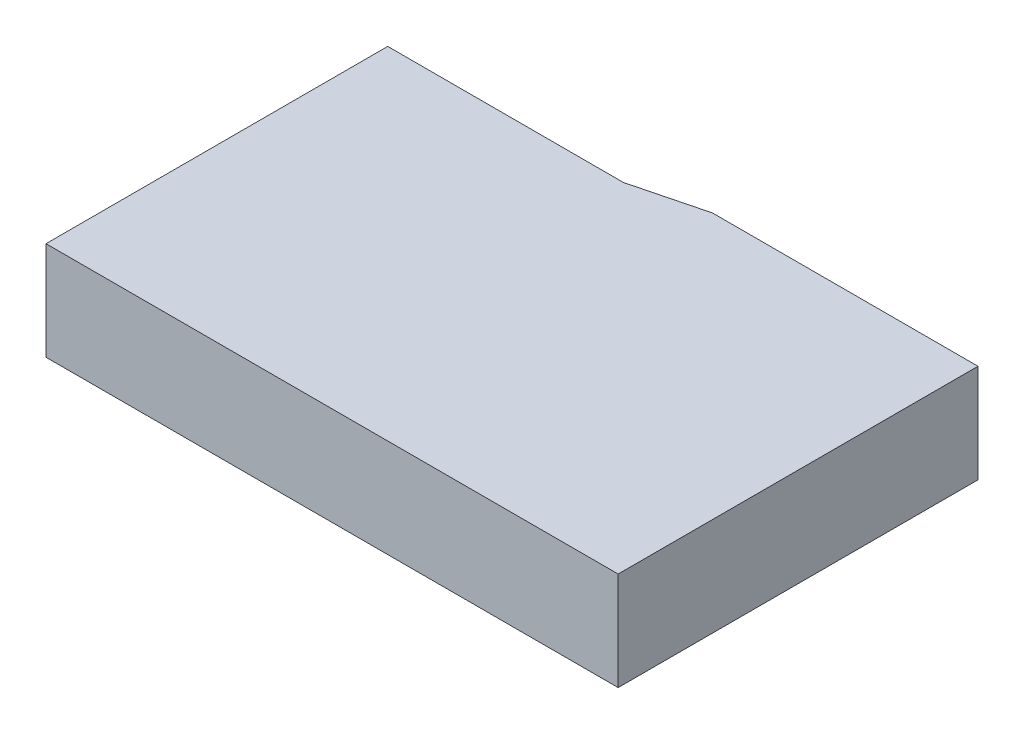
ISO-10303-21;
HEADER;
FILE_DESCRIPTION(('STEP AP214'),'2;1');
FILE_NAME('part.step','',(''),(''),'','','');
FILE_SCHEMA(('AUTOMOTIVE_DESIGN { 1 0 10303 214 1 1 1 1 }'));
ENDSEC;
DATA;
#1=APPLICATION_CONTEXT('core data for automotive mechanical design processes');
#2=APPLICATION_PROTOCOL_DEFINITION('international standard','automotive_design',2000,#1);
#3=PRODUCT_CONTEXT('',#1,'mechanical');
#4=PRODUCT('Part','Part','',(#3));
#5=PRODUCT_RELATED_PRODUCT_CATEGORY('part','',(#4));
#6=PRODUCT_DEFINITION_FORMATION('','',#4);
#7=PRODUCT_DEFINITION_CONTEXT('part definition',#1,'design');
#8=PRODUCT_DEFINITION('design','',#6,#7);
#9=PRODUCT_DEFINITION_SHAPE('','',#8);
#10=(LENGTH_UNIT() NAMED_UNIT(*) SI_UNIT(.MILLI.,.METRE.));
#11=(NAMED_UNIT(*) PLANE_ANGLE_UNIT() SI_UNIT($,.RADIAN.));
#12=(NAMED_UNIT(*) SI_UNIT($,.STERADIAN.) SOLID_ANGLE_UNIT());
#13=UNCERTAINTY_MEASURE_WITH_UNIT(LENGTH_MEASURE(1.E-05),#10,'distance_accuracy_value','');
#14=(GEOMETRIC_REPRESENTATION_CONTEXT(3) GLOBAL_UNCERTAINTY_ASSIGNED_CONTEXT((#13)) GLOBAL_UNIT_ASSIGNED_CONTEXT((#10,
#11,#12)) REPRESENTATION_CONTEXT('',''));
#15=CARTESIAN_POINT('',(0.,0.,0.));
#16=DIRECTION('',(0.,0.,1.));
#17=DIRECTION('',(1.,0.,0.));
#18=AXIS2_PLACEMENT_3D('',#15,#16,#17);
#19=CARTESIAN_POINT('',(0.,19.,0.));
#20=DIRECTION('',(0.,0.,1.));
#21=DIRECTION('',(1.,0.,0.));
#22=AXIS2_PLACEMENT_3D('',#19,#20,#21);
#23=PLANE('',#22);
#24=DIRECTION('',(0.,1.,0.));
#25=VECTOR('',#24,1.);
#26=CARTESIAN_POINT('',(45.5311099738506,-65.0630976147762,0.));
#27=LINE('',#26,#25);
#28=CARTESIAN_POINT('',(45.5311099738506,0.,0.));
#29=VERTEX_POINT('',#28);
#30=CARTESIAN_POINT('',(45.5311099738506,19.,0.));
#31=VERTEX_POINT('',#30);
#32=EDGE_CURVE('E59',#29,#31,#27,.T.);
#33=ORIENTED_EDGE('',*,*,#32,.F.);
#34=DIRECTION('',(-1.,0.,0.));
#35=VECTOR('',#34,1.);
#36=CARTESIAN_POINT('',(0.,0.,0.));
#37=LINE('',#36,#35);
#38=CARTESIAN_POINT('',(0.,0.,0.));
#39=VERTEX_POINT('',#38);
#40=EDGE_CURVE('E81',#29,#39,#37,.T.);
#41=ORIENTED_EDGE('',*,*,#40,.T.);
#42=DIRECTION('',(0.,-1.,0.));
#43=VECTOR('',#42,1.);
#44=CARTESIAN_POINT('',(0.,19.,0.));
#45=LINE('',#44,#43);
#46=CARTESIAN_POINT('',(0.,19.,0.));
#47=VERTEX_POINT('',#46);
#48=EDGE_CURVE('E148',#47,#39,#45,.T.);
#49=ORIENTED_EDGE('',*,*,#48,.F.);
#50=DIRECTION('',(-1.,0.,0.));
#51=VECTOR('',#50,1.);
#52=CARTESIAN_POINT('',(0.,19.,0.));
#53=LINE('',#52,#51);
#54=EDGE_CURVE('E67',#31,#47,#53,.T.);
#55=ORIENTED_EDGE('',*,*,#54,.F.);
#56=EDGE_LOOP('',(#33,#41,#49,#55));
#57=FACE_BOUND('',#56,.T.);
#58=ADVANCED_FACE('F43',(#57),#23,.F.);
#59=CARTESIAN_POINT('',(0.,19.,0.));
#60=DIRECTION('',(1.,0.,0.));
#61=DIRECTION('',(0.,0.,-1.));
#62=AXIS2_PLACEMENT_3D('',#59,#60,#61);
#63=PLANE('',#62);
#64=DIRECTION('',(0.,0.,1.));
#65=VECTOR('',#64,1.);
#66=CARTESIAN_POINT('',(0.,0.,0.));
#67=LINE('',#66,#65);
#68=CARTESIAN_POINT('',(0.,0.,66.));
#69=VERTEX_POINT('',#68);
#70=EDGE_CURVE('E140',#39,#69,#67,.T.);
#71=ORIENTED_EDGE('',*,*,#70,.T.);
#72=DIRECTION('',(0.,-1.,0.));
#73=VECTOR('',#72,1.);
#74=CARTESIAN_POINT('',(0.,19.,66.));
#75=LINE('',#74,#73);
#76=CARTESIAN_POINT('',(0.,19.,66.));
#77=VERTEX_POINT('',#76);
#78=EDGE_CURVE('E11',#77,#69,#75,.T.);
#79=ORIENTED_EDGE('',*,*,#78,.F.);
#80=DIRECTION('',(0.,0.,1.));
#81=VECTOR('',#80,1.);
#82=CARTESIAN_POINT('',(0.,19.,0.));
#83=LINE('',#82,#81);
#84=EDGE_CURVE('E141',#47,#77,#83,.T.);
#85=ORIENTED_EDGE('',*,*,#84,.F.);
#86=ORIENTED_EDGE('',*,*,#48,.T.);
#87=EDGE_LOOP('',(#71,#79,#85,#86));
#88=FACE_BOUND('',#87,.T.);
#89=ADVANCED_FACE('F45',(#88),#63,.F.);
#90=CARTESIAN_POINT('',(0.,19.,66.));
#91=DIRECTION('',(0.,0.,-1.));
#92=DIRECTION('',(-1.,0.,0.));
#93=AXIS2_PLACEMENT_3D('',#90,#91,#92);
#94=PLANE('',#93);
#95=DIRECTION('',(1.,0.,0.));
#96=VECTOR('',#95,1.);
#97=CARTESIAN_POINT('',(0.,0.,66.));
#98=LINE('',#97,#96);
#99=CARTESIAN_POINT('',(110.5,0.,66.));
#100=VERTEX_POINT('',#99);
#101=EDGE_CURVE('E152',#69,#100,#98,.T.);
#102=ORIENTED_EDGE('',*,*,#101,.T.);
#103=DIRECTION('',(0.,-1.,0.));
#104=VECTOR('',#103,1.);
#105=CARTESIAN_POINT('',(110.5,19.,66.));
#106=LINE('',#105,#104);
#107=CARTESIAN_POINT('',(110.5,19.,66.));
#108=VERTEX_POINT('',#107);
#109=EDGE_CURVE('E52',#108,#100,#106,.T.);
#110=ORIENTED_EDGE('',*,*,#109,.F.);
#111=DIRECTION('',(1.,0.,0.));
#112=VECTOR('',#111,1.);
#113=CARTESIAN_POINT('',(0.,19.,66.));
#114=LINE('',#113,#112);
#115=EDGE_CURVE('E86',#77,#108,#114,.T.);
#116=ORIENTED_EDGE('',*,*,#115,.F.);
#117=ORIENTED_EDGE('',*,*,#78,.T.);
#118=EDGE_LOOP('',(#102,#110,#116,#117));
#119=FACE_BOUND('',#118,.T.);
#120=ADVANCED_FACE('F181',(#119),#94,.F.);
#121=CARTESIAN_POINT('',(110.5,19.,0.));
#122=DIRECTION('',(-1.,0.,0.));
#123=DIRECTION('',(0.,0.,1.));
#124=AXIS2_PLACEMENT_3D('',#121,#122,#123);
#125=PLANE('',#124);
#126=DIRECTION('',(0.,0.,-1.));
#127=VECTOR('',#126,1.);
#128=CARTESIAN_POINT('',(110.5,0.,0.));
#129=LINE('',#128,#127);
#130=CARTESIAN_POINT('',(110.5,0.,-3.5));
#131=VERTEX_POINT('',#130);
#132=EDGE_CURVE('E115',#100,#131,#129,.T.);
#133=ORIENTED_EDGE('',*,*,#132,.T.);
#134=DIRECTION('',(0.,1.,0.));
#135=VECTOR('',#134,1.);
#136=CARTESIAN_POINT('',(110.5,-65.0630976147762,-3.5));
#137=LINE('',#136,#135);
#138=CARTESIAN_POINT('',(110.5,19.,-3.5));
#139=VERTEX_POINT('',#138);
#140=EDGE_CURVE('E112',#131,#139,#137,.T.);
#141=ORIENTED_EDGE('',*,*,#140,.T.);
#142=DIRECTION('',(0.,0.,-1.));
#143=VECTOR('',#142,1.);
#144=CARTESIAN_POINT('',(110.5,19.,0.));
#145=LINE('',#144,#143);
#146=EDGE_CURVE('E102',#108,#139,#145,.T.);
#147=ORIENTED_EDGE('',*,*,#146,.F.);
#148=ORIENTED_EDGE('',*,*,#109,.T.);
#149=EDGE_LOOP('',(#133,#141,#147,#148));
#150=FACE_BOUND('',#149,.T.);
#151=ADVANCED_FACE('F113',(#150),#125,.F.);
#152=CARTESIAN_POINT('',(0.,19.,0.));
#153=DIRECTION('',(0.,1.,0.));
#154=DIRECTION('',(0.,0.,1.));
#155=AXIS2_PLACEMENT_3D('',#152,#153,#154);
#156=PLANE('',#155);
#157=ORIENTED_EDGE('',*,*,#84,.T.);
#158=ORIENTED_EDGE('',*,*,#115,.T.);
#159=ORIENTED_EDGE('',*,*,#146,.T.);
#160=DIRECTION('',(-1.,0.,0.));
#161=VECTOR('',#160,1.);
#162=CARTESIAN_POINT('',(59.2180107495722,19.,-3.5));
#163=LINE('',#162,#161);
#164=CARTESIAN_POINT('',(59.2180107495722,19.,-3.5));
#165=VERTEX_POINT('',#164);
#166=EDGE_CURVE('E106',#139,#165,#163,.T.);
#167=ORIENTED_EDGE('',*,*,#166,.T.);
#168=DIRECTION('',(-0.968824798204931,0.,0.247746867554717));
#169=VECTOR('',#168,1.);
#170=CARTESIAN_POINT('',(45.5311099738506,19.,0.));
#171=LINE('',#170,#169);
#172=EDGE_CURVE('E121',#165,#31,#171,.T.);
#173=ORIENTED_EDGE('',*,*,#172,.T.);
#174=ORIENTED_EDGE('',*,*,#54,.T.);
#175=EDGE_LOOP('',(#157,#158,#159,#167,#173,#174));
#176=FACE_BOUND('',#175,.T.);
#177=ADVANCED_FACE('F104',(#176),#156,.T.);
#178=CARTESIAN_POINT('',(0.,0.,0.));
#179=DIRECTION('',(0.,1.,0.));
#180=DIRECTION('',(0.,0.,1.));
#181=AXIS2_PLACEMENT_3D('',#178,#179,#180);
#182=PLANE('',#181);
#183=ORIENTED_EDGE('',*,*,#70,.F.);
#184=ORIENTED_EDGE('',*,*,#40,.F.);
#185=DIRECTION('',(0.968824798204931,0.,-0.247746867554717));
#186=VECTOR('',#185,1.);
#187=CARTESIAN_POINT('',(45.5311099738506,0.,0.));
#188=LINE('',#187,#186);
#189=CARTESIAN_POINT('',(59.2180107495722,0.,-3.5));
#190=VERTEX_POINT('',#189);
#191=EDGE_CURVE('E131',#29,#190,#188,.T.);
#192=ORIENTED_EDGE('',*,*,#191,.T.);
#193=DIRECTION('',(1.,0.,0.));
#194=VECTOR('',#193,1.);
#195=CARTESIAN_POINT('',(59.2180107495722,0.,-3.5));
#196=LINE('',#195,#194);
#197=EDGE_CURVE('E137',#190,#131,#196,.T.);
#198=ORIENTED_EDGE('',*,*,#197,.T.);
#199=ORIENTED_EDGE('',*,*,#132,.F.);
#200=ORIENTED_EDGE('',*,*,#101,.F.);
#201=EDGE_LOOP('',(#183,#184,#192,#198,#199,#200));
#202=FACE_BOUND('',#201,.T.);
#203=ADVANCED_FACE('F163',(#202),#182,.F.);
#204=CARTESIAN_POINT('',(45.5311099738506,-65.0630976147762,0.));
#205=DIRECTION('',(-0.247746867554717,0.,-0.968824798204931));
#206=DIRECTION('',(-0.968824798204931,0.,0.247746867554717));
#207=AXIS2_PLACEMENT_3D('',#204,#205,#206);
#208=PLANE('',#207);
#209=ORIENTED_EDGE('',*,*,#191,.F.);
#210=ORIENTED_EDGE('',*,*,#32,.T.);
#211=ORIENTED_EDGE('',*,*,#172,.F.);
#212=DIRECTION('',(0.,1.,0.));
#213=VECTOR('',#212,1.);
#214=CARTESIAN_POINT('',(59.2180107495722,-65.0630976147762,-3.5));
#215=LINE('',#214,#213);
#216=EDGE_CURVE('E120',#190,#165,#215,.T.);
#217=ORIENTED_EDGE('',*,*,#216,.F.);
#218=EDGE_LOOP('',(#209,#210,#211,#217));
#219=FACE_BOUND('',#218,.T.);
#220=ADVANCED_FACE('F167',(#219),#208,.T.);
#221=CARTESIAN_POINT('',(59.2180107495722,-65.0630976147762,-3.5));
#222=DIRECTION('',(0.,0.,-1.));
#223=DIRECTION('',(-1.,0.,0.));
#224=AXIS2_PLACEMENT_3D('',#221,#222,#223);
#225=PLANE('',#224);
#226=ORIENTED_EDGE('',*,*,#197,.F.);
#227=ORIENTED_EDGE('',*,*,#216,.T.);
#228=ORIENTED_EDGE('',*,*,#166,.F.);
#229=ORIENTED_EDGE('',*,*,#140,.F.);
#230=EDGE_LOOP('',(#226,#227,#228,#229));
#231=FACE_BOUND('',#230,.T.);
#232=ADVANCED_FACE('F123',(#231),#225,.T.);
#233=CLOSED_SHELL('',(#58,#89,#120,#151,#177,#203,#220,#232));
#234=MANIFOLD_SOLID_BREP('B2',#233);
#235=ADVANCED_BREP_SHAPE_REPRESENTATION('',(#18,#234),#14);
#236=SHAPE_DEFINITION_REPRESENTATION(#9,#235);
ENDSEC;
END-ISO-10303-21;
